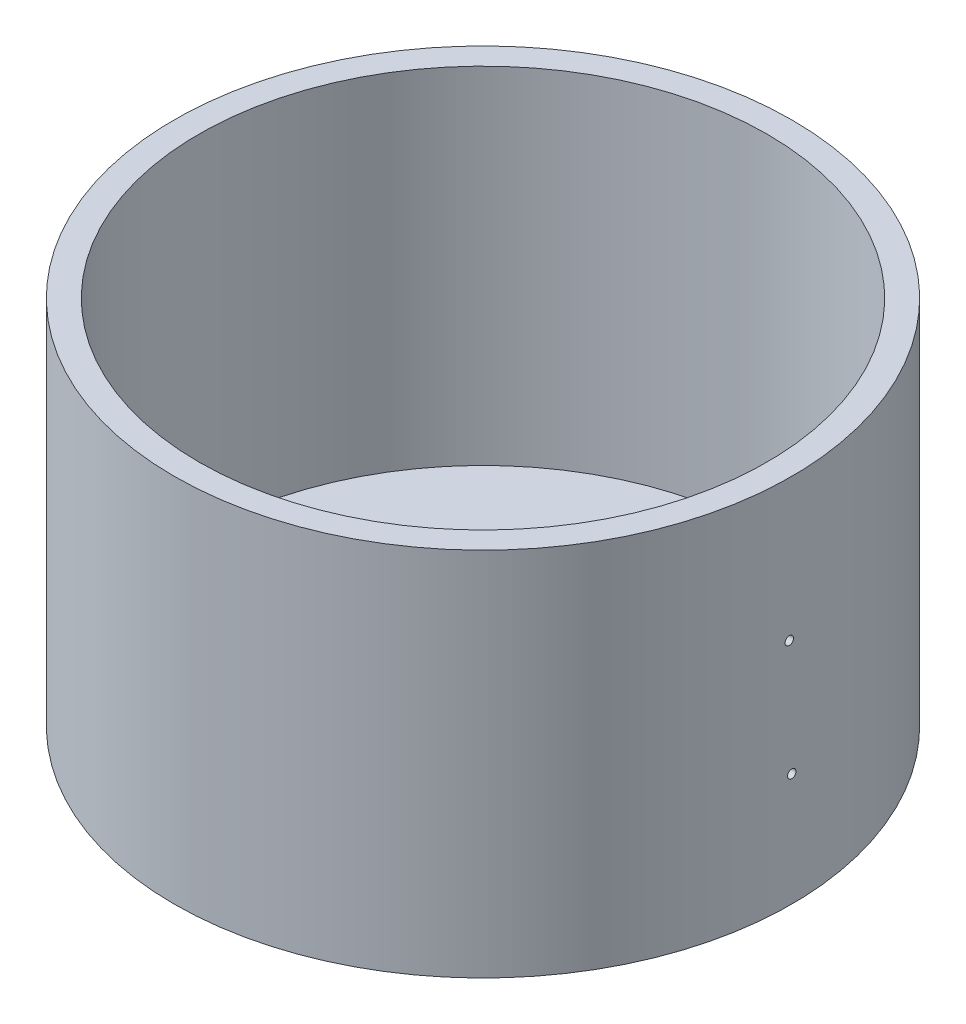
ISO-10303-21;
HEADER;
FILE_DESCRIPTION(('STEP AP214'),'2;1');
FILE_NAME('part.step','',(''),(''),'','','');
FILE_SCHEMA(('AUTOMOTIVE_DESIGN { 1 0 10303 214 1 1 1 1 }'));
ENDSEC;
DATA;
#1=APPLICATION_CONTEXT('core data for automotive mechanical design processes');
#2=APPLICATION_PROTOCOL_DEFINITION('international standard','automotive_design',2000,#1);
#3=PRODUCT_CONTEXT('',#1,'mechanical');
#4=PRODUCT('Part','Part','',(#3));
#5=PRODUCT_RELATED_PRODUCT_CATEGORY('part','',(#4));
#6=PRODUCT_DEFINITION_FORMATION('','',#4);
#7=PRODUCT_DEFINITION_CONTEXT('part definition',#1,'design');
#8=PRODUCT_DEFINITION('design','',#6,#7);
#9=PRODUCT_DEFINITION_SHAPE('','',#8);
#10=(LENGTH_UNIT() NAMED_UNIT(*) SI_UNIT(.MILLI.,.METRE.));
#11=(NAMED_UNIT(*) PLANE_ANGLE_UNIT() SI_UNIT($,.RADIAN.));
#12=(NAMED_UNIT(*) SI_UNIT($,.STERADIAN.) SOLID_ANGLE_UNIT());
#13=UNCERTAINTY_MEASURE_WITH_UNIT(LENGTH_MEASURE(1.E-05),#10,'distance_accuracy_value','');
#14=(GEOMETRIC_REPRESENTATION_CONTEXT(3) GLOBAL_UNCERTAINTY_ASSIGNED_CONTEXT((#13)) GLOBAL_UNIT_ASSIGNED_CONTEXT((#10,
#11,#12)) REPRESENTATION_CONTEXT('',''));
#15=CARTESIAN_POINT('',(0.,0.,0.));
#16=DIRECTION('',(0.,0.,1.));
#17=DIRECTION('',(1.,0.,0.));
#18=AXIS2_PLACEMENT_3D('',#15,#16,#17);
#19=CARTESIAN_POINT('',(0.,14.,0.));
#20=DIRECTION('',(0.,1.,0.));
#21=DIRECTION('',(0.,0.,1.));
#22=AXIS2_PLACEMENT_3D('',#19,#20,#21);
#23=PLANE('',#22);
#24=CARTESIAN_POINT('',(0.,14.,0.));
#25=DIRECTION('',(0.,1.,0.));
#26=DIRECTION('',(0.,0.,1.));
#27=AXIS2_PLACEMENT_3D('',#24,#25,#26);
#28=CIRCLE('',#27,12.5);
#29=CARTESIAN_POINT('',(0.,14.,12.5));
#30=VERTEX_POINT('',#29);
#31=EDGE_CURVE('E11',#30,#30,#28,.T.);
#32=ORIENTED_EDGE('',*,*,#31,.T.);
#33=EDGE_LOOP('',(#32));
#34=FACE_BOUND('',#33,.T.);
#35=CARTESIAN_POINT('',(0.,14.,0.));
#36=DIRECTION('',(0.,1.,0.));
#37=DIRECTION('',(0.,0.,1.));
#38=AXIS2_PLACEMENT_3D('',#35,#36,#37);
#39=CIRCLE('',#38,11.5);
#40=CARTESIAN_POINT('',(0.,14.,11.5));
#41=VERTEX_POINT('',#40);
#42=EDGE_CURVE('E47',#41,#41,#39,.T.);
#43=ORIENTED_EDGE('',*,*,#42,.F.);
#44=EDGE_LOOP('',(#43));
#45=FACE_BOUND('',#44,.T.);
#46=ADVANCED_FACE('F39',(#34,#45),#23,.T.);
#47=CARTESIAN_POINT('',(0.,14.,0.));
#48=DIRECTION('',(0.,-1.,0.));
#49=DIRECTION('',(0.,0.,-1.));
#50=AXIS2_PLACEMENT_3D('',#47,#48,#49);
#51=CYLINDRICAL_SURFACE('',#50,12.5);
#52=CARTESIAN_POINT('',(12.4988241405942,3.57071421427142,-0.171449999999998));
#53=CARTESIAN_POINT('',(12.4988241564897,3.56108427849612,-0.171449573108833));
#54=CARTESIAN_POINT('',(12.4988353894392,3.55144737163831,-0.170635941775235));
#55=CARTESIAN_POINT('',(12.4988791196705,3.53243899670103,-0.167401514259049));
#56=CARTESIAN_POINT('',(12.4989116425058,3.52306786173924,-0.164978786678887));
#57=CARTESIAN_POINT('',(12.4989942675654,3.50486916281607,-0.158595179027112));
#58=CARTESIAN_POINT('',(12.4990443613493,3.49604134026136,-0.154635037361099));
#59=CARTESIAN_POINT('',(12.499156472882,3.4791783084326,-0.145290039115101));
#60=CARTESIAN_POINT('',(12.4992184876761,3.47114290349781,-0.139905535448438));
#61=CARTESIAN_POINT('',(12.4993474693085,3.45608861623541,-0.127863197336434));
#62=CARTESIAN_POINT('',(12.4994144369543,3.44906990022909,-0.121205154963924));
#63=CARTESIAN_POINT('',(12.4995457690715,3.43624958200024,-0.106804971167462));
#64=CARTESIAN_POINT('',(12.4996101334402,3.43044802771516,-0.0990627870649975));
#65=CARTESIAN_POINT('',(12.4997290012404,3.42022693003412,-0.0827140795091494));
#66=CARTESIAN_POINT('',(12.4997835044671,3.41580741533368,-0.0741075381138695));
#67=CARTESIAN_POINT('',(12.4998765033571,3.40847606719091,-0.0562745665442332));
#68=CARTESIAN_POINT('',(12.4999149990592,3.40556423008758,-0.0470481378751746));
#69=CARTESIAN_POINT('',(12.4999716409529,3.40133105593308,-0.0282378937282546));
#70=CARTESIAN_POINT('',(12.4999897884037,3.40000962046215,-0.0186541004032442));
#71=CARTESIAN_POINT('',(12.5000036920833,3.39899445965524,0.000599305876418873));
#72=CARTESIAN_POINT('',(12.4999994483627,3.39930073064158,0.0102689186371204));
#73=CARTESIAN_POINT('',(12.4999690493056,3.40153219820659,0.029418807275805));
#74=CARTESIAN_POINT('',(12.499942895436,3.40345728639992,0.03889909578619));
#75=CARTESIAN_POINT('',(12.4998716261683,3.40887157573919,0.0574019187093725));
#76=CARTESIAN_POINT('',(12.4998265107458,3.41236077891122,0.0664244525291939));
#77=CARTESIAN_POINT('',(12.499722401915,3.4208043749562,0.0837559839014298));
#78=CARTESIAN_POINT('',(12.4996634080367,3.4257588174735,0.09206495726511));
#79=CARTESIAN_POINT('',(12.4995381928694,3.43699221209604,0.107733234171841));
#80=CARTESIAN_POINT('',(12.4994719715793,3.4432711644102,0.115092537565095));
#81=CARTESIAN_POINT('',(12.4993397604413,3.45697595683135,0.128653204980415));
#82=CARTESIAN_POINT('',(12.4992737706129,3.46440189150277,0.134854473433616));
#83=CARTESIAN_POINT('',(12.4991494677224,3.48018951600459,0.145922301157656));
#84=CARTESIAN_POINT('',(12.4990911546613,3.48855120596267,0.150788860246397));
#85=CARTESIAN_POINT('',(12.4989887802446,3.50597302949739,0.159049110400682));
#86=CARTESIAN_POINT('',(12.4989447189162,3.51503316441429,0.162442798639831));
#87=CARTESIAN_POINT('',(12.4988758169095,3.53359466489638,0.167660910491331));
#88=CARTESIAN_POINT('',(12.4988509762195,3.54309603019476,0.169485335052576));
#89=CARTESIAN_POINT('',(12.498823318131,3.56226944733358,0.171513013278816));
#90=CARTESIAN_POINT('',(12.4988204989377,3.57194148519885,0.171716399067476));
#91=CARTESIAN_POINT('',(12.498837197009,3.59118241703778,0.17049657032615));
#92=CARTESIAN_POINT('',(12.498856714269,3.60075131103273,0.169073356131785));
#93=CARTESIAN_POINT('',(12.498915883247,3.61951395610147,0.164640837274858));
#94=CARTESIAN_POINT('',(12.4989555342058,3.62870772130483,0.161631592411038));
#95=CARTESIAN_POINT('',(12.4990504996852,3.6464595584801,0.154112496478124));
#96=CARTESIAN_POINT('',(12.4991058142108,3.65501763024966,0.149602644931332));
#97=CARTESIAN_POINT('',(12.4992258750651,3.67125575242663,0.139210015684152));
#98=CARTESIAN_POINT('',(12.4992906220048,3.67893574590167,0.13332714903608));
#99=CARTESIAN_POINT('',(12.4994222459704,3.69319913115882,0.120355614691317));
#100=CARTESIAN_POINT('',(12.4994891229981,3.69978252200555,0.113266945966116));
#101=CARTESIAN_POINT('',(12.4996174726421,3.7116662579856,0.0980844670978376));
#102=CARTESIAN_POINT('',(12.4996789448983,3.71696651766415,0.0899905900635572));
#103=CARTESIAN_POINT('',(12.4997895495131,3.72613294534521,0.0730278044933128));
#104=CARTESIAN_POINT('',(12.4998386818879,3.72999911522173,0.0641588969701468));
#105=CARTESIAN_POINT('',(12.499919065951,3.73618747045952,0.0458981308480849));
#106=CARTESIAN_POINT('',(12.4999503182867,3.73850971172444,0.0365062911972305));
#107=CARTESIAN_POINT('',(12.499991421519,3.7415444743687,0.0174659824576813));
#108=CARTESIAN_POINT('',(12.5000012723891,3.74225699374799,0.00781751305014225));
#109=CARTESIAN_POINT('',(12.4999984620695,3.74205207427057,-0.0114612849088314));
#110=CARTESIAN_POINT('',(12.499985802768,3.74113477212864,-0.0210916149140246));
#111=CARTESIAN_POINT('',(12.4999394028404,3.73769652541236,-0.0400615860799494));
#112=CARTESIAN_POINT('',(12.4999056621719,3.73517557762167,-0.0494012266576221));
#113=CARTESIAN_POINT('',(12.4998209021093,3.72860157331025,-0.0675248661282858));
#114=CARTESIAN_POINT('',(12.4997698823969,3.72454848856591,-0.0763088547820909));
#115=CARTESIAN_POINT('',(12.4996563176869,3.71502544705143,-0.093071387901461));
#116=CARTESIAN_POINT('',(12.4995937731344,3.70955554499503,-0.101049963453429));
#117=CARTESIAN_POINT('',(12.4994642081614,3.6973542617891,-0.115975490829977));
#118=CARTESIAN_POINT('',(12.4993971878418,3.69062290909902,-0.122922465922057));
#119=CARTESIAN_POINT('',(12.4992662075862,3.67608749351592,-0.135589510892068));
#120=CARTESIAN_POINT('',(12.4992022484143,3.66828316462835,-0.141309275637148));
#121=CARTESIAN_POINT('',(12.4990845895153,3.65182162322303,-0.151359767296736));
#122=CARTESIAN_POINT('',(12.4990308950682,3.64316397522941,-0.155689780128846));
#123=CARTESIAN_POINT('',(12.498939927589,3.62525130430899,-0.162829842577893));
#124=CARTESIAN_POINT('',(12.4989026349024,3.61599701169213,-0.165641712340383));
#125=CARTESIAN_POINT('',(12.4988586867257,3.60068890970445,-0.168917132614973));
#126=CARTESIAN_POINT('',(12.4988457878337,3.59473454722617,-0.169865770453667));
#127=CARTESIAN_POINT('',(12.4988285097966,3.58275910381797,-0.171132337643618));
#128=CARTESIAN_POINT('',(12.4988241306511,3.57673802289209,-0.171450267033002));
#129=CARTESIAN_POINT('',(12.4988241405942,3.57071421427142,-0.171449999999998));
#130=B_SPLINE_CURVE_WITH_KNOTS('',3,(#52,#53,#54,#55,#56,#57,#58,#59,#60,#61,#62,#63,#64,#65,
#66,#67,#68,#69,#70,#71,#72,#73,#74,#75,#76,#77,#78,#79,#80,#81,#82,#83,#84,#85,#86,#87,#88,#89,
#90,#91,#92,#93,#94,#95,#96,#97,#98,#99,#100,#101,#102,#103,#104,#105,#106,#107,#108,#109,#110,
#111,#112,#113,#114,#115,#116,#117,#118,#119,#120,#121,#122,#123,#124,#125,#126,#127,#128,#129),
.UNSPECIFIED.,.T.,.F.,(4,2,2,2,2,2,2,2,2,2,2,2,2,2,2,2,2,2,2,2,2,2,2,2,2,2,2,2,2,2,2,2,2,2,2,2,
2,2,4),(0.,0.0288678202741477,0.0577703533533085,0.0866590219558274,0.115540539523517,
0.14442677652838,0.173314150993716,0.202202125212701,0.231090029284362,0.259976145577032,
0.288862196603919,0.317746313765023,0.346630468341699,0.37551560166597,0.404400739546441,
0.433288260171118,0.462175784736983,0.491063364736866,0.519950927269145,0.54883613528051,
0.577721337331919,0.606605450391011,0.635489572644942,0.664375566611181,0.693261585216394,
0.722149527061677,0.751037431157209,0.779924289202177,0.808811183138672,0.837695654062151,
0.866580182917777,0.895465243883424,0.924349189550298,0.95323248364775,0.982122950969183,
1.01102823911537,1.03989879448331,1.05795646788809,1.07601414020126),.UNSPECIFIED.);
#131=CARTESIAN_POINT('',(12.4988241405942,3.57071421427142,-0.171449999999998));
#132=VERTEX_POINT('',#131);
#133=EDGE_CURVE('E114',#132,#132,#130,.T.);
#134=ORIENTED_EDGE('',*,*,#133,.T.);
#135=EDGE_LOOP('',(#134));
#136=FACE_BOUND('',#135,.T.);
#137=CARTESIAN_POINT('',(12.4997923006283,8.2915619758885,-0.0720585952804092));
#138=CARTESIAN_POINT('',(12.4997923131289,8.28193204011319,-0.0720581682763445));
#139=CARTESIAN_POINT('',(12.4997970760305,8.27229513325539,-0.0712444733452226));
#140=CARTESIAN_POINT('',(12.4998150859189,8.25328675831811,-0.0680098003579632));
#141=CARTESIAN_POINT('',(12.4998283431006,8.24391562335632,-0.0655868907621199));
#142=CARTESIAN_POINT('',(12.4998602054826,8.22571692443315,-0.0592028279224478));
#143=CARTESIAN_POINT('',(12.4998788081145,8.21688910187844,-0.0552424131279879));
#144=CARTESIAN_POINT('',(12.4999166081648,8.20002607004968,-0.045896818852091));
#145=CARTESIAN_POINT('',(12.4999358054349,8.19199066511489,-0.040511992296314));
#146=CARTESIAN_POINT('',(12.4999690268117,8.17693637785249,-0.0284690092852222));
#147=CARTESIAN_POINT('',(12.4999830500726,8.16991766184617,-0.021810644902892));
#148=CARTESIAN_POINT('',(12.499999873151,8.15709734361732,-0.00740987205970985));
#149=CARTESIAN_POINT('',(12.5000026725267,8.15129578933224,0.000332579077488639));
#150=CARTESIAN_POINT('',(12.4999915377485,8.1410746916512,0.0166817149664974));
#151=CARTESIAN_POINT('',(12.4999776032474,8.13665517695075,0.0252884176580085));
#152=CARTESIAN_POINT('',(12.4999287980634,8.12932382880799,0.0431215649363498));
#153=CARTESIAN_POINT('',(12.4998939274315,8.12641199170466,0.0523480080182388));
#154=CARTESIAN_POINT('',(12.4998009954939,8.12217881755016,0.0711581078804366));
#155=CARTESIAN_POINT('',(12.4997429356237,8.12085738207923,0.0807417425186074));
#156=CARTESIAN_POINT('',(12.4996037429633,8.11984222127232,0.0999946506647909));
#157=CARTESIAN_POINT('',(12.4995226102254,8.12014849225866,0.109663923979261));
#158=CARTESIAN_POINT('',(12.4993399393625,8.12237995982367,0.128812965478316));
#159=CARTESIAN_POINT('',(12.4992384026041,8.124305048017,0.138292746306569));
#160=CARTESIAN_POINT('',(12.4990200080479,8.12971933735627,0.156794417562241));
#161=CARTESIAN_POINT('',(12.4989031502303,8.1332085405283,0.165816307396508));
#162=CARTESIAN_POINT('',(12.4986612308225,8.14165213657328,0.183146463003298));
#163=CARTESIAN_POINT('',(12.4985361689544,8.14660657909058,0.191454704584112));
#164=CARTESIAN_POINT('',(12.4982863694559,8.15783997371312,0.20712149047895));
#165=CARTESIAN_POINT('',(12.4981616318257,8.16411892602728,0.214480034643173));
#166=CARTESIAN_POINT('',(12.4979215955017,8.17782371844844,0.228039222048658));
#167=CARTESIAN_POINT('',(12.4978062975875,8.18524965311985,0.234239769724234));
#168=CARTESIAN_POINT('',(12.4975939913918,8.20103727762167,0.245306259132211));
#169=CARTESIAN_POINT('',(12.4974969831128,8.20939896757975,0.25017220068253));
#170=CARTESIAN_POINT('',(12.4973289295065,8.22682079111447,0.258431375648466));
#171=CARTESIAN_POINT('',(12.4972578842289,8.23588092603137,0.261824606237998));
#172=CARTESIAN_POINT('',(12.4971474919227,8.25444242651345,0.267042005237502));
#173=CARTESIAN_POINT('',(12.4971081448749,8.26394379181184,0.268866174596247));
#174=CARTESIAN_POINT('',(12.4970643643204,8.28311720895066,0.270893568791285));
#175=CARTESIAN_POINT('',(12.4970599279683,8.29278924681593,0.271096925732794));
#176=CARTESIAN_POINT('',(12.4970863251346,8.31203017865486,0.269877268332799));
#177=CARTESIAN_POINT('',(12.4971171586456,8.32159907264981,0.268454254326867));
#178=CARTESIAN_POINT('',(12.4972115714885,8.34036171771855,0.26402234609225));
#179=CARTESIAN_POINT('',(12.4972751495857,8.34955548292191,0.26101351165438));
#180=CARTESIAN_POINT('',(12.4974299011072,8.36730732009718,0.253495408565352));
#181=CARTESIAN_POINT('',(12.4975210745402,8.37586539186674,0.248986139436552));
#182=CARTESIAN_POINT('',(12.4977237699076,8.3921035140437,0.238594793428159));
#183=CARTESIAN_POINT('',(12.4978352931601,8.39978350751875,0.232712627608553));
#184=CARTESIAN_POINT('',(12.4980700577639,8.4140468927759,0.219742549979391));
#185=CARTESIAN_POINT('',(12.4981932991252,8.42063028362263,0.212654637141372));
#186=CARTESIAN_POINT('',(12.4984423701166,8.43251401960268,0.197473658850824));
#187=CARTESIAN_POINT('',(12.4985681999185,8.43781427928123,0.189380526506343));
#188=CARTESIAN_POINT('',(12.4988136827761,8.44698070696229,0.172419156695815));
#189=CARTESIAN_POINT('',(12.4989333358399,8.45084687683881,0.163550920242661));
#190=CARTESIAN_POINT('',(12.499158920158,8.4570352320766,0.145291370613011));
#191=CARTESIAN_POINT('',(12.4992648519091,8.45935747334152,0.135900076389105));
#192=CARTESIAN_POINT('',(12.4994573552703,8.46239223598578,0.116860696440456));
#193=CARTESIAN_POINT('',(12.4995439268563,8.46310475536506,0.107212610396668));
#194=CARTESIAN_POINT('',(12.4996944144311,8.46289983588765,0.0879343995841821));
#195=CARTESIAN_POINT('',(12.4997583323195,8.46198253374572,0.0783042733767862));
#196=CARTESIAN_POINT('',(12.499862775989,8.45854428702943,0.0593345329855948));
#197=CARTESIAN_POINT('',(12.4999033017231,8.45602333923874,0.0499949193845035));
#198=CARTESIAN_POINT('',(12.4999626567566,8.44944933492732,0.0318711789065891));
#199=CARTESIAN_POINT('',(12.4999814856563,8.44539625018299,0.0230870622660972));
#200=CARTESIAN_POINT('',(12.5000012139433,8.4358732086685,0.00632415606472431));
#201=CARTESIAN_POINT('',(12.500002114023,8.43040330661211,-0.00165466457803769));
#202=CARTESIAN_POINT('',(12.4999912353689,8.41820202340618,-0.0165807503410632));
#203=CARTESIAN_POINT('',(12.4999794569211,8.4114706707161,-0.023528038727288));
#204=CARTESIAN_POINT('',(12.49994920442,8.396935255133,-0.0361957247387821));
#205=CARTESIAN_POINT('',(12.4999307287045,8.38913092624542,-0.0419158172347719));
#206=CARTESIAN_POINT('',(12.4998929912836,8.37266938484011,-0.0519669267308926));
#207=CARTESIAN_POINT('',(12.4998737291799,8.36401173684648,-0.0562972296292181));
#208=CARTESIAN_POINT('',(12.4998395396882,8.34609906592607,-0.0634377896868901));
#209=CARTESIAN_POINT('',(12.4998246071194,8.33684477330921,-0.0662498670905309));
#210=CARTESIAN_POINT('',(12.4998067052516,8.32153667132153,-0.0695255332732425));
#211=CARTESIAN_POINT('',(12.4998013499814,8.31558230884325,-0.070474243688226));
#212=CARTESIAN_POINT('',(12.4997941437601,8.30360686543505,-0.0717409082245576));
#213=CARTESIAN_POINT('',(12.4997922928088,8.29758578450916,-0.0720588623840354));
#214=CARTESIAN_POINT('',(12.4997923006283,8.2915619758885,-0.0720585952804092));
#215=B_SPLINE_CURVE_WITH_KNOTS('',3,(#137,#138,#139,#140,#141,#142,#143,#144,#145,#146,#147,
#148,#149,#150,#151,#152,#153,#154,#155,#156,#157,#158,#159,#160,#161,#162,#163,#164,#165,#166,
#167,#168,#169,#170,#171,#172,#173,#174,#175,#176,#177,#178,#179,#180,#181,#182,#183,#184,#185,
#186,#187,#188,#189,#190,#191,#192,#193,#194,#195,#196,#197,#198,#199,#200,#201,#202,#203,#204,
#205,#206,#207,#208,#209,#210,#211,#212,#213,#214),.UNSPECIFIED.,.T.,.F.,(4,2,2,2,2,2,2,2,2,2,2,
2,2,2,2,2,2,2,2,2,2,2,2,2,2,2,2,2,2,2,2,2,2,2,2,2,2,2,4),(0.,0.0288678202741468,
0.0577703533533089,0.086659021955828,0.115540539523516,0.144426776528379,0.173314150993715,
0.202202125212701,0.231090029284362,0.259976145577031,0.288862196603917,0.317746313765021,
0.346630468341697,0.375515601665968,0.404400739546439,0.433288260171115,0.462175784736977,
0.491063364736858,0.519950927269141,0.548836135280505,0.577721337331914,0.606605450391004,
0.635489572644935,0.664375566611176,0.693261585216388,0.72214952706167,0.751037431157202,
0.779924289202169,0.808811183138665,0.837695654062144,0.866580182917769,0.895465243883416,
0.924349189550289,0.95323248364774,0.982122950969173,1.01102823911536,1.0398987944833,
1.05795646788808,1.07601414020125),.UNSPECIFIED.);
#216=CARTESIAN_POINT('',(12.4997923006283,8.2915619758885,-0.0720585952804092));
#217=VERTEX_POINT('',#216);
#218=EDGE_CURVE('E64',#217,#217,#215,.T.);
#219=ORIENTED_EDGE('',*,*,#218,.T.);
#220=EDGE_LOOP('',(#219));
#221=FACE_BOUND('',#220,.T.);
#222=ORIENTED_EDGE('',*,*,#31,.F.);
#223=EDGE_LOOP('',(#222));
#224=FACE_BOUND('',#223,.T.);
#225=CARTESIAN_POINT('',(0.,-1.,0.));
#226=DIRECTION('',(0.,-1.,0.));
#227=DIRECTION('',(0.,0.,-1.));
#228=AXIS2_PLACEMENT_3D('',#225,#226,#227);
#229=CIRCLE('',#228,12.5);
#230=CARTESIAN_POINT('',(0.,-1.,-12.5));
#231=VERTEX_POINT('',#230);
#232=EDGE_CURVE('E56',#231,#231,#229,.T.);
#233=ORIENTED_EDGE('',*,*,#232,.F.);
#234=EDGE_LOOP('',(#233));
#235=FACE_BOUND('',#234,.T.);
#236=ADVANCED_FACE('F41',(#136,#221,#224,#235),#51,.T.);
#237=CARTESIAN_POINT('',(0.,14.,0.));
#238=DIRECTION('',(0.,-1.,0.));
#239=DIRECTION('',(0.,0.,-1.));
#240=AXIS2_PLACEMENT_3D('',#237,#238,#239);
#241=CYLINDRICAL_SURFACE('',#240,11.5);
#242=CARTESIAN_POINT('',(11.4987218810396,3.57071421427142,-0.171449999999998));
#243=CARTESIAN_POINT('',(11.498721898316,3.56108436669346,-0.171449573138786));
#244=CARTESIAN_POINT('',(11.4987341080316,3.55144755018875,-0.1706359566504));
#245=CARTESIAN_POINT('',(11.498781640776,3.53243935951865,-0.16740159153696));
#246=CARTESIAN_POINT('',(11.4988169915723,3.52306831837484,-0.164978912111117));
#247=CARTESIAN_POINT('',(11.4989068009855,3.50486980756569,-0.158595439896359));
#248=CARTESIAN_POINT('',(11.4989612504198,3.49604207907259,-0.154635386169095));
#249=CARTESIAN_POINT('',(11.4990831099393,3.47917921670401,-0.145290603061124));
#250=CARTESIAN_POINT('',(11.4991505168151,3.47114388730827,-0.139906226338102));
#251=CARTESIAN_POINT('',(11.4992907139959,3.45608963675613,-0.127864109764524));
#252=CARTESIAN_POINT('',(11.499363505236,3.44907089277106,-0.121206148420716));
#253=CARTESIAN_POINT('',(11.4995062584002,3.43625049834647,-0.106806121822571));
#254=CARTESIAN_POINT('',(11.4995762202128,3.430448895869,-0.0990640138669462));
#255=CARTESIAN_POINT('',(11.4997054262004,3.42022764352948,-0.0827153825426209));
#256=CARTESIAN_POINT('',(11.4997646700762,3.41580803224389,-0.0741088350530769));
#257=CARTESIAN_POINT('',(11.4998657583036,3.40847649830131,-0.056275818809496));
#258=CARTESIAN_POINT('',(11.4999076026987,3.40556457186906,-0.047049351607803));
#259=CARTESIAN_POINT('',(11.4999691719105,3.40133126155021,-0.028239112318603));
#260=CARTESIAN_POINT('',(11.4999888983519,3.40000976083534,-0.0186553665291209));
#261=CARTESIAN_POINT('',(11.5000040131695,3.39899445706576,0.000597959008173164));
#262=CARTESIAN_POINT('',(11.4999994016028,3.39930065019832,0.0102675385548736));
#263=CARTESIAN_POINT('',(11.4999663617941,3.40153193657227,0.0294172515796395));
#264=CARTESIAN_POINT('',(11.4999379354376,3.40345690165181,0.0388973999945686));
#265=CARTESIAN_POINT('',(11.4998604727616,3.40887089213747,0.0573999634418614));
#266=CARTESIAN_POINT('',(11.4998114364145,3.41235991963757,0.0664223778613912));
#267=CARTESIAN_POINT('',(11.4996982785328,3.42080313953992,0.0837537588920781));
#268=CARTESIAN_POINT('',(11.4996341563936,3.42575739067335,0.0920626968874284));
#269=CARTESIAN_POINT('',(11.4994980555184,3.43699037660987,0.107730944252372));
#270=CARTESIAN_POINT('',(11.4994260767805,3.44326911175707,0.115090253375244));
#271=CARTESIAN_POINT('',(11.4992823686587,3.45697356202762,0.128651088425052));
#272=CARTESIAN_POINT('',(11.4992106392998,3.4643993888477,0.134852501473156));
#273=CARTESIAN_POINT('',(11.4990755239039,3.48018683255348,0.14592063735533));
#274=CARTESIAN_POINT('',(11.4990121378679,3.48854844956789,0.150787360005812));
#275=CARTESIAN_POINT('',(11.4989008561584,3.5059701739711,0.159047949785911));
#276=CARTESIAN_POINT('',(11.4988529605202,3.51503028295465,0.162441813552664));
#277=CARTESIAN_POINT('',(11.4987780612298,3.53359177496641,0.167660273038762));
#278=CARTESIAN_POINT('',(11.4987510575629,3.54309315768295,0.169484869866454));
#279=CARTESIAN_POINT('',(11.4987209892963,3.56226650218027,0.171512863156494));
#280=CARTESIAN_POINT('',(11.4987179223917,3.57193844744668,0.171716415718845));
#281=CARTESIAN_POINT('',(11.4987360674155,3.59117922167376,0.170496948782262));
#282=CARTESIAN_POINT('',(11.4987572793379,3.60074805066041,0.169073929693171));
#283=CARTESIAN_POINT('',(11.4988215885053,3.61951052861126,0.164641843587392));
#284=CARTESIAN_POINT('',(11.4988646847752,3.62870419427359,0.161632847244076));
#285=CARTESIAN_POINT('',(11.4989679031542,3.64645587714927,0.154114294774045));
#286=CARTESIAN_POINT('',(11.4990280252701,3.65501389410851,0.149604738047472));
#287=CARTESIAN_POINT('',(11.4991585228516,3.67125206368913,0.1392126744808));
#288=CARTESIAN_POINT('',(11.4992288991021,3.67893214903186,0.133330062524105));
#289=CARTESIAN_POINT('',(11.4993719680021,3.69319576864207,0.120359030096475));
#290=CARTESIAN_POINT('',(11.4994446606538,3.699779301885,0.113270608498895));
#291=CARTESIAN_POINT('',(11.4995841737215,3.71166344932332,0.0980885066489004));
#292=CARTESIAN_POINT('',(11.4996509936756,3.71696396262756,0.0899947474167259));
#293=CARTESIAN_POINT('',(11.499771221559,3.72613091183131,0.0730321381218002));
#294=CARTESIAN_POINT('',(11.4998246295065,3.72999734967011,0.064163289107207));
#295=CARTESIAN_POINT('',(11.4999120101122,3.73618622019666,0.0459026374270674));
#296=CARTESIAN_POINT('',(11.4999459836003,3.73850871881482,0.0365108571106731));
#297=CARTESIAN_POINT('',(11.4999906685012,3.74154400106068,0.017470614890809));
#298=CARTESIAN_POINT('',(11.5000013798875,3.74225678285179,0.00782215269449248));
#299=CARTESIAN_POINT('',(11.4999983329668,3.74205238487218,-0.0114565301488314));
#300=CARTESIAN_POINT('',(11.4999845770762,3.74113536606239,-0.0210867525031959));
#301=CARTESIAN_POINT('',(11.4999341509552,3.73769772464079,-0.0400565541825338));
#302=CARTESIAN_POINT('',(11.4998974806789,3.73517709881437,-0.0493961329248382));
#303=CARTESIAN_POINT('',(11.4998053584425,3.72860377331504,-0.0675197005358746));
#304=CARTESIAN_POINT('',(11.4997499061374,3.72455104549303,-0.0763036791931797));
#305=CARTESIAN_POINT('',(11.499626472893,3.71502874437523,-0.0930662583401702));
#306=CARTESIAN_POINT('',(11.499558492436,3.70955922562528,-0.101044889818941));
#307=CARTESIAN_POINT('',(11.4994176635775,3.69735862809583,-0.115970720491559));
#308=CARTESIAN_POINT('',(11.4993448152134,3.6906275589915,-0.122917927594942));
#309=CARTESIAN_POINT('',(11.4992024429195,3.6760926681158,-0.135585487271789));
#310=CARTESIAN_POINT('',(11.4991329198197,3.66828858037749,-0.141305534768895));
#311=CARTESIAN_POINT('',(11.499005022936,3.65182740786585,-0.151356669960392));
#312=CARTESIAN_POINT('',(11.4989466549625,3.64316988210478,-0.155687034609261));
#313=CARTESIAN_POINT('',(11.4988477673935,3.62525737657358,-0.162827812013487));
#314=CARTESIAN_POINT('',(11.4988072264398,3.61600312705869,-0.16564004453518));
#315=CARTESIAN_POINT('',(11.4987594447411,3.60069405832844,-0.168916256035824));
#316=CARTESIAN_POINT('',(11.4987454191633,3.59473868830954,-0.169865221811839));
#317=CARTESIAN_POINT('',(11.4987266319085,3.58276119289673,-0.171132227302883));
#318=CARTESIAN_POINT('',(11.4987218702308,3.5767390675076,-0.171450267063016));
#319=CARTESIAN_POINT('',(11.4987218810396,3.57071421427142,-0.171449999999998));
#320=B_SPLINE_CURVE_WITH_KNOTS('',3,(#242,#243,#244,#245,#246,#247,#248,#249,#250,#251,#252,
#253,#254,#255,#256,#257,#258,#259,#260,#261,#262,#263,#264,#265,#266,#267,#268,#269,#270,#271,
#272,#273,#274,#275,#276,#277,#278,#279,#280,#281,#282,#283,#284,#285,#286,#287,#288,#289,#290,
#291,#292,#293,#294,#295,#296,#297,#298,#299,#300,#301,#302,#303,#304,#305,#306,#307,#308,#309,
#310,#311,#312,#313,#314,#315,#316,#317,#318,#319),.UNSPECIFIED.,.T.,.F.,(4,2,2,2,2,2,2,2,2,2,2,
2,2,2,2,2,2,2,2,2,2,2,2,2,2,2,2,2,2,2,2,2,2,2,2,2,2,2,4),(0.,0.0288675518389101,
0.0577698061344998,0.0866581834257551,0.115539414733875,0.1444256734452,0.173313070219898,
0.20220127327662,0.231089403996951,0.259975412545369,0.288861353430683,0.317745007565728,
0.346628700370431,0.375513551089343,0.404398409312741,0.433286081941267,0.462173758543329,
0.491061501102029,0.519949223257777,0.548834163609138,0.577719096682436,0.606602742711388,
0.635486400286779,0.664372269825751,0.693258166354295,0.72214633360832,0.751034461797328,
0.779921356305468,0.808808283771908,0.83769235849197,0.866576491113773,0.895461154445635,
0.924344705895783,0.953228035839348,0.982118537984782,1.01102404744492,1.03989483085202,
1.05795563338738,1.07601643463157),.UNSPECIFIED.);
#321=CARTESIAN_POINT('',(11.4987218810396,3.57071421427142,-0.171449999999998));
#322=VERTEX_POINT('',#321);
#323=EDGE_CURVE('E128',#322,#322,#320,.T.);
#324=ORIENTED_EDGE('',*,*,#323,.F.);
#325=EDGE_LOOP('',(#324));
#326=FACE_BOUND('',#325,.T.);
#327=CARTESIAN_POINT('',(11.4997216589904,8.2915619758885,-0.080011035160392));
#328=CARTESIAN_POINT('',(11.499721672872,8.28193212831054,-0.0800106081752993));
#329=CARTESIAN_POINT('',(11.4997274126269,8.27229531180583,-0.0791969203220401));
#330=CARTESIAN_POINT('',(11.4997492254044,8.25328712113573,-0.0759622794993896));
#331=CARTESIAN_POINT('',(11.4997653108406,8.24391607999192,-0.0735393955694525));
#332=CARTESIAN_POINT('',(11.499804358426,8.22571756918278,-0.0671554110352181));
#333=CARTESIAN_POINT('',(11.4998273172699,8.21688984068967,-0.0631950495422213));
#334=CARTESIAN_POINT('',(11.4998748667095,8.20002697832109,-0.0538495928851976));
#335=CARTESIAN_POINT('',(11.4998994569002,8.19199164892535,-0.0484648503932258));
#336=CARTESIAN_POINT('',(11.4999438952324,8.17693739837321,-0.0364219997317018));
#337=CARTESIAN_POINT('',(11.4999637425478,8.16991865438814,-0.0297636700684646));
#338=CARTESIAN_POINT('',(11.4999919875622,8.15709825996355,-0.0153629636027262));
#339=CARTESIAN_POINT('',(11.5000003848102,8.15129665748608,-0.00762054410117516));
#340=CARTESIAN_POINT('',(11.4999995884988,8.14107540514656,0.00872859776412884));
#341=CARTESIAN_POINT('',(11.4999903944484,8.13665579386097,0.0173353442455836));
#342=CARTESIAN_POINT('',(11.4999496779909,8.12932425991839,0.0351686005198485));
#343=CARTESIAN_POINT('',(11.4999181556397,8.12641233348614,0.0443951087607102));
#344=CARTESIAN_POINT('',(11.4998301509031,8.12217902316729,0.063205242945535));
#345=CARTESIAN_POINT('',(11.4997736703515,8.12085752245241,0.0727888426052238));
#346=CARTESIAN_POINT('',(11.4996356894329,8.11984221868284,0.0920416796421081));
#347=CARTESIAN_POINT('',(11.4995541891246,8.1201484118154,0.101710916818652));
#348=CARTESIAN_POINT('',(11.4993688789901,8.12237969818935,0.12085976171107));
#349=CARTESIAN_POINT('',(11.4992650709306,8.12430466326889,0.130339384378329));
#350=CARTESIAN_POINT('',(11.4990404852251,8.12971865375455,0.148840746918643));
#351=CARTESIAN_POINT('',(11.4989197075564,8.13320768125465,0.157862486178665));
#352=CARTESIAN_POINT('',(11.4986687405791,8.141650901157,0.175192419493983));
#353=CARTESIAN_POINT('',(11.4985385508934,8.14660515229043,0.183500584929568));
#354=CARTESIAN_POINT('',(11.4982778662662,8.15783813822695,0.199167254724467));
#355=CARTESIAN_POINT('',(11.4981473713246,8.16411687337415,0.206525758837052));
#356=CARTESIAN_POINT('',(11.4978958370474,8.1778213236447,0.220085022452002));
#357=CARTESIAN_POINT('',(11.4977747986343,8.18524715046478,0.226285669079305));
#358=CARTESIAN_POINT('',(11.4975516778246,8.20103459417056,0.237352380658666));
#359=CARTESIAN_POINT('',(11.4974495954306,8.20939621118498,0.242218445427152));
#360=CARTESIAN_POINT('',(11.4972726321125,8.22681793558818,0.2504778891807));
#361=CARTESIAN_POINT('',(11.4971977512506,8.23587804457173,0.253871264803285));
#362=CARTESIAN_POINT('',(11.4970813590861,8.25443953658348,0.259088963738235));
#363=CARTESIAN_POINT('',(11.4970398477599,8.26394091930002,0.260913288158795));
#364=CARTESIAN_POINT('',(11.4969936545982,8.28311426379735,0.262940978242836));
#365=CARTESIAN_POINT('',(11.4969889692166,8.29278620906375,0.263144499983056));
#366=CARTESIAN_POINT('',(11.4970168104127,8.31202698329083,0.261925215881992));
#367=CARTESIAN_POINT('',(11.4970493369811,8.32159581227749,0.260502410450489));
#368=CARTESIAN_POINT('',(11.4971488864099,8.34035829022834,0.256070975826207));
#369=CARTESIAN_POINT('',(11.4972159077331,8.34955195589067,0.253062417296811));
#370=CARTESIAN_POINT('',(11.4973789075718,8.36730363876634,0.245544923277462));
#371=CARTESIAN_POINT('',(11.4974748860988,8.37586165572558,0.241035987187724));
#372=CARTESIAN_POINT('',(11.4976880133653,8.39209982530621,0.230645289830914));
#373=CARTESIAN_POINT('',(11.4978051637255,8.39977991064893,0.224763423456811));
#374=CARTESIAN_POINT('',(11.4980513689108,8.41404353025915,0.211793938734762));
#375=CARTESIAN_POINT('',(11.4981804237472,8.42062706350207,0.204706319260223));
#376=CARTESIAN_POINT('',(11.4984406548115,8.4325112109404,0.189525806743419));
#377=CARTESIAN_POINT('',(11.4985718312054,8.43781172424463,0.181432834720217));
#378=CARTESIAN_POINT('',(11.4988269356257,8.44697867344839,0.164471717700074));
#379=CARTESIAN_POINT('',(11.4989508636619,8.45084511128718,0.155603573751402));
#380=CARTESIAN_POINT('',(11.4991834433914,8.45703398181374,0.137344194193951));
#381=CARTESIAN_POINT('',(11.499292095737,8.4593564804319,0.127952980940218));
#382=CARTESIAN_POINT('',(11.4994881801246,8.46239176267776,0.108913695989243));
#383=CARTESIAN_POINT('',(11.4995756121424,8.46310454446886,0.0992656239989528));
#384=CARTESIAN_POINT('',(11.4997258622082,8.46290014648926,0.0799875264171138));
#385=CARTESIAN_POINT('',(11.4997886826862,8.46198312767946,0.0703574991374759));
#386=CARTESIAN_POINT('',(11.4998890989419,8.45854548625787,0.0513878962127262));
#387=CARTESIAN_POINT('',(11.499926694669,8.45602486043145,0.0420483211498995));
#388=CARTESIAN_POINT('',(11.4999786871901,8.44945153493212,0.023924593988083));
#389=CARTESIAN_POINT('',(11.4999930835578,8.4453988071101,0.0151404520974532));
#390=CARTESIAN_POINT('',(11.5000029439884,8.4358765059923,-0.00162257860098711));
#391=CARTESIAN_POINT('',(11.4999984087801,8.43040698724235,-0.0096014983930677));
#392=CARTESIAN_POINT('',(11.4999762690083,8.41820638971291,-0.0245279770087872));
#393=CARTESIAN_POINT('',(11.4999586645451,8.41147532060858,-0.0314755437414152));
#394=CARTESIAN_POINT('',(11.4999170244586,8.39694042973288,-0.0441438350287111));
#395=CARTESIAN_POINT('',(11.4998929872394,8.38913634199457,-0.0498642545100643));
#396=CARTESIAN_POINT('',(11.4998450172747,8.37267516948293,-0.0599160889263824));
#397=CARTESIAN_POINT('',(11.4998210845898,8.36401764372186,-0.0642467807924824));
#398=CARTESIAN_POINT('',(11.4997789809437,8.34610513819066,-0.0713881187603278));
#399=CARTESIAN_POINT('',(11.4997608030951,8.33685088867577,-0.0742005847407121));
#400=CARTESIAN_POINT('',(11.499739074118,8.32154181994552,-0.0774770726071991));
#401=CARTESIAN_POINT('',(11.4997325948053,8.31558644992661,-0.0784261199081205));
#402=CARTESIAN_POINT('',(11.4997238828992,8.30360895451381,-0.0796932347324239));
#403=CARTESIAN_POINT('',(11.4997216503055,8.29758682912468,-0.0800113023009149));
#404=CARTESIAN_POINT('',(11.4997216589904,8.2915619758885,-0.080011035160392));
#405=B_SPLINE_CURVE_WITH_KNOTS('',3,(#327,#328,#329,#330,#331,#332,#333,#334,#335,#336,#337,
#338,#339,#340,#341,#342,#343,#344,#345,#346,#347,#348,#349,#350,#351,#352,#353,#354,#355,#356,
#357,#358,#359,#360,#361,#362,#363,#364,#365,#366,#367,#368,#369,#370,#371,#372,#373,#374,#375,
#376,#377,#378,#379,#380,#381,#382,#383,#384,#385,#386,#387,#388,#389,#390,#391,#392,#393,#394,
#395,#396,#397,#398,#399,#400,#401,#402,#403,#404),.UNSPECIFIED.,.T.,.F.,(4,2,2,2,2,2,2,2,2,2,2,
2,2,2,2,2,2,2,2,2,2,2,2,2,2,2,2,2,2,2,2,2,2,2,2,2,2,2,4),(0.,0.0288675518389087,
0.0577698061344989,0.0866581834257532,0.115539414733873,0.144425673445199,0.173313070219898,
0.20220127327662,0.231089403996949,0.259975412545367,0.28886135343068,0.317745007565725,
0.346628700370427,0.375513551089339,0.404398409312738,0.433286081941263,0.462173758543325,
0.491061501102023,0.519949223257771,0.548834163609128,0.577719096682428,0.606602742711382,
0.635486400286771,0.664372269825745,0.693258166354288,0.722146333608312,0.75103446179732,
0.77992135630546,0.8088082837719,0.837692358491962,0.866576491113764,0.895461154445626,
0.924344705895773,0.953228035839336,0.982118537984771,1.01102404744491,1.03989483085201,
1.05795563338737,1.07601643463156),.UNSPECIFIED.);
#406=CARTESIAN_POINT('',(11.4997216589904,8.2915619758885,-0.080011035160392));
#407=VERTEX_POINT('',#406);
#408=EDGE_CURVE('E72',#407,#407,#405,.T.);
#409=ORIENTED_EDGE('',*,*,#408,.F.);
#410=EDGE_LOOP('',(#409));
#411=FACE_BOUND('',#410,.T.);
#412=ORIENTED_EDGE('',*,*,#42,.T.);
#413=EDGE_LOOP('',(#412));
#414=FACE_BOUND('',#413,.T.);
#415=CARTESIAN_POINT('',(0.,0.,0.));
#416=DIRECTION('',(0.,1.,0.));
#417=DIRECTION('',(0.,0.,1.));
#418=AXIS2_PLACEMENT_3D('',#415,#416,#417);
#419=CIRCLE('',#418,11.5);
#420=CARTESIAN_POINT('',(0.,0.,11.5));
#421=VERTEX_POINT('',#420);
#422=EDGE_CURVE('E51',#421,#421,#419,.T.);
#423=ORIENTED_EDGE('',*,*,#422,.F.);
#424=EDGE_LOOP('',(#423));
#425=FACE_BOUND('',#424,.T.);
#426=ADVANCED_FACE('F99',(#326,#411,#414,#425),#241,.F.);
#427=CARTESIAN_POINT('',(0.,0.,0.));
#428=DIRECTION('',(0.,-1.,0.));
#429=DIRECTION('',(0.,0.,-1.));
#430=AXIS2_PLACEMENT_3D('',#427,#428,#429);
#431=PLANE('',#430);
#432=CARTESIAN_POINT('',(0.,0.,0.));
#433=DIRECTION('',(0.,-1.,0.));
#434=DIRECTION('',(0.,0.,-1.));
#435=AXIS2_PLACEMENT_3D('',#432,#433,#434);
#436=CIRCLE('',#435,7.5);
#437=CARTESIAN_POINT('',(0.,0.,-7.5));
#438=VERTEX_POINT('',#437);
#439=EDGE_CURVE('E61',#438,#438,#436,.T.);
#440=ORIENTED_EDGE('',*,*,#439,.T.);
#441=EDGE_LOOP('',(#440));
#442=FACE_BOUND('',#441,.T.);
#443=ORIENTED_EDGE('',*,*,#422,.T.);
#444=EDGE_LOOP('',(#443));
#445=FACE_BOUND('',#444,.T.);
#446=ADVANCED_FACE('F95',(#442,#445),#431,.F.);
#447=CARTESIAN_POINT('',(0.,-1.,0.));
#448=DIRECTION('',(0.,-1.,0.));
#449=DIRECTION('',(0.,0.,-1.));
#450=AXIS2_PLACEMENT_3D('',#447,#448,#449);
#451=PLANE('',#450);
#452=ORIENTED_EDGE('',*,*,#232,.T.);
#453=EDGE_LOOP('',(#452));
#454=FACE_BOUND('',#453,.T.);
#455=CARTESIAN_POINT('',(0.,-1.,0.));
#456=DIRECTION('',(0.,-1.,0.));
#457=DIRECTION('',(0.,0.,-1.));
#458=AXIS2_PLACEMENT_3D('',#455,#456,#457);
#459=CIRCLE('',#458,7.5);
#460=CARTESIAN_POINT('',(0.,-1.,-7.5));
#461=VERTEX_POINT('',#460);
#462=EDGE_CURVE('E60',#461,#461,#459,.T.);
#463=ORIENTED_EDGE('',*,*,#462,.F.);
#464=EDGE_LOOP('',(#463));
#465=FACE_BOUND('',#464,.T.);
#466=ADVANCED_FACE('F91',(#454,#465),#451,.T.);
#467=CARTESIAN_POINT('',(0.,-1.,0.));
#468=DIRECTION('',(0.,1.,0.));
#469=DIRECTION('',(0.,0.,1.));
#470=AXIS2_PLACEMENT_3D('',#467,#468,#469);
#471=CYLINDRICAL_SURFACE('',#470,7.5);
#472=ORIENTED_EDGE('',*,*,#462,.T.);
#473=EDGE_LOOP('',(#472));
#474=FACE_BOUND('',#473,.T.);
#475=ORIENTED_EDGE('',*,*,#439,.F.);
#476=EDGE_LOOP('',(#475));
#477=FACE_BOUND('',#476,.T.);
#478=ADVANCED_FACE('F82',(#474,#477),#471,.F.);
#479=CARTESIAN_POINT('',(12.4996048164534,8.2915619758885,0.0993953343771683));
#480=DIRECTION('',(0.999968385316269,0.,0.00795162675017346));
#481=DIRECTION('',(0.00795162675017346,0.,-0.999968385316269));
#482=AXIS2_PLACEMENT_3D('',#479,#480,#481);
#483=CYLINDRICAL_SURFACE('',#482,0.171449999999997);
#484=ORIENTED_EDGE('',*,*,#408,.T.);
#485=EDGE_LOOP('',(#484));
#486=FACE_BOUND('',#485,.T.);
#487=ORIENTED_EDGE('',*,*,#218,.F.);
#488=EDGE_LOOP('',(#487));
#489=FACE_BOUND('',#488,.T.);
#490=ADVANCED_FACE('F77',(#486,#489),#483,.F.);
#491=CARTESIAN_POINT('',(12.5,3.57071421427142,0.));
#492=DIRECTION('',(1.,0.,0.));
#493=DIRECTION('',(0.,0.,-1.));
#494=AXIS2_PLACEMENT_3D('',#491,#492,#493);
#495=CYLINDRICAL_SURFACE('',#494,0.171449999999999);
#496=ORIENTED_EDGE('',*,*,#323,.T.);
#497=EDGE_LOOP('',(#496));
#498=FACE_BOUND('',#497,.T.);
#499=ORIENTED_EDGE('',*,*,#133,.F.);
#500=EDGE_LOOP('',(#499));
#501=FACE_BOUND('',#500,.T.);
#502=ADVANCED_FACE('F81',(#498,#501),#495,.F.);
#503=CLOSED_SHELL('',(#46,#236,#426,#446,#466,#478,#490,#502));
#504=MANIFOLD_SOLID_BREP('B2',#503);
#505=ADVANCED_BREP_SHAPE_REPRESENTATION('',(#18,#504),#14);
#506=SHAPE_DEFINITION_REPRESENTATION(#9,#505);
ENDSEC;
END-ISO-10303-21;
